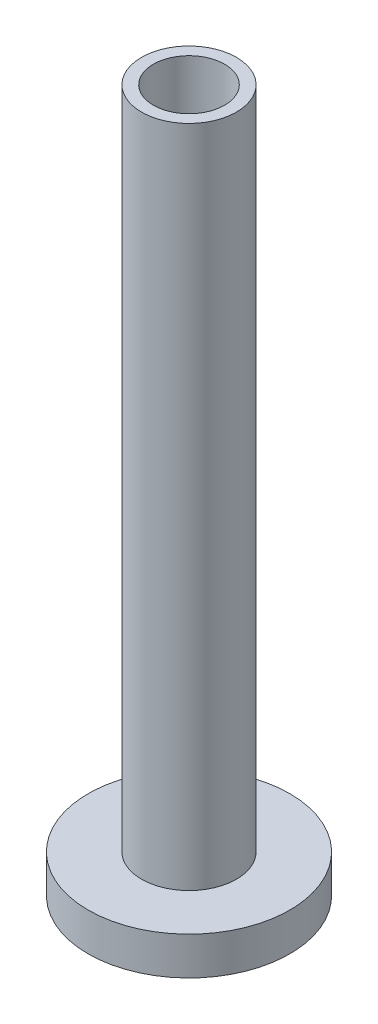
ISO-10303-21;
HEADER;
FILE_DESCRIPTION(('STEP AP214'),'2;1');
FILE_NAME('part.step','',(''),(''),'','','');
FILE_SCHEMA(('AUTOMOTIVE_DESIGN { 1 0 10303 214 1 1 1 1 }'));
ENDSEC;
DATA;
#1=APPLICATION_CONTEXT('core data for automotive mechanical design processes');
#2=APPLICATION_PROTOCOL_DEFINITION('international standard','automotive_design',2000,#1);
#3=PRODUCT_CONTEXT('',#1,'mechanical');
#4=PRODUCT('Part','Part','',(#3));
#5=PRODUCT_RELATED_PRODUCT_CATEGORY('part','',(#4));
#6=PRODUCT_DEFINITION_FORMATION('','',#4);
#7=PRODUCT_DEFINITION_CONTEXT('part definition',#1,'design');
#8=PRODUCT_DEFINITION('design','',#6,#7);
#9=PRODUCT_DEFINITION_SHAPE('','',#8);
#10=(LENGTH_UNIT() NAMED_UNIT(*) SI_UNIT(.MILLI.,.METRE.));
#11=(NAMED_UNIT(*) PLANE_ANGLE_UNIT() SI_UNIT($,.RADIAN.));
#12=(NAMED_UNIT(*) SI_UNIT($,.STERADIAN.) SOLID_ANGLE_UNIT());
#13=UNCERTAINTY_MEASURE_WITH_UNIT(LENGTH_MEASURE(1.E-05),#10,'distance_accuracy_value','');
#14=(GEOMETRIC_REPRESENTATION_CONTEXT(3) GLOBAL_UNCERTAINTY_ASSIGNED_CONTEXT((#13)) GLOBAL_UNIT_ASSIGNED_CONTEXT((#10,
#11,#12)) REPRESENTATION_CONTEXT('',''));
#15=CARTESIAN_POINT('',(0.,0.,0.));
#16=DIRECTION('',(0.,0.,1.));
#17=DIRECTION('',(1.,0.,0.));
#18=AXIS2_PLACEMENT_3D('',#15,#16,#17);
#19=CARTESIAN_POINT('',(0.,0.5,0.));
#20=DIRECTION('',(0.,-1.,0.));
#21=DIRECTION('',(0.,0.,-1.));
#22=AXIS2_PLACEMENT_3D('',#19,#20,#21);
#23=PLANE('',#22);
#24=DIRECTION('',(-0.5,0.,0.866025403784439));
#25=VECTOR('',#24,1.);
#26=CARTESIAN_POINT('',(-2.03647161368473,0.5,0.148273985177666));
#27=LINE('',#26,#25);
#28=CARTESIAN_POINT('',(-2.03647161368473,0.5,0.148273985177666));
#29=VERTEX_POINT('',#28);
#30=CARTESIAN_POINT('',(-1.3147837771977,0.5,-1.10172601482233));
#31=VERTEX_POINT('',#30);
#32=EDGE_CURVE('E90',#29,#31,#27,.F.);
#33=ORIENTED_EDGE('',*,*,#32,.T.);
#34=DIRECTION('',(-1.,0.,0.));
#35=VECTOR('',#34,1.);
#36=CARTESIAN_POINT('',(-1.3147837771977,0.5,-1.10172601482233));
#37=LINE('',#36,#35);
#38=CARTESIAN_POINT('',(0.128591895776368,0.5,-1.10172601482233));
#39=VERTEX_POINT('',#38);
#40=EDGE_CURVE('E132',#31,#39,#37,.F.);
#41=ORIENTED_EDGE('',*,*,#40,.T.);
#42=DIRECTION('',(-0.5,0.,-0.866025403784439));
#43=VECTOR('',#42,1.);
#44=CARTESIAN_POINT('',(0.128591895776368,0.5,-1.10172601482233));
#45=LINE('',#44,#43);
#46=CARTESIAN_POINT('',(0.8502797322634,0.5,0.148273985177666));
#47=VERTEX_POINT('',#46);
#48=EDGE_CURVE('E127',#39,#47,#45,.F.);
#49=ORIENTED_EDGE('',*,*,#48,.T.);
#50=DIRECTION('',(0.5,0.,-0.866025403784439));
#51=VECTOR('',#50,1.);
#52=CARTESIAN_POINT('',(0.8502797322634,0.5,0.148273985177666));
#53=LINE('',#52,#51);
#54=CARTESIAN_POINT('',(0.128591895776368,0.5,1.39827398517767));
#55=VERTEX_POINT('',#54);
#56=EDGE_CURVE('E73',#47,#55,#53,.F.);
#57=ORIENTED_EDGE('',*,*,#56,.T.);
#58=DIRECTION('',(1.,0.,0.));
#59=VECTOR('',#58,1.);
#60=CARTESIAN_POINT('',(0.128591895776368,0.5,1.39827398517767));
#61=LINE('',#60,#59);
#62=CARTESIAN_POINT('',(-1.3147837771977,0.5,1.39827398517767));
#63=VERTEX_POINT('',#62);
#64=EDGE_CURVE('E70',#55,#63,#61,.F.);
#65=ORIENTED_EDGE('',*,*,#64,.T.);
#66=DIRECTION('',(0.5,0.,0.866025403784439));
#67=VECTOR('',#66,1.);
#68=CARTESIAN_POINT('',(-1.3147837771977,0.5,1.39827398517767));
#69=LINE('',#68,#67);
#70=EDGE_CURVE('E67',#63,#29,#69,.F.);
#71=ORIENTED_EDGE('',*,*,#70,.T.);
#72=EDGE_LOOP('',(#33,#41,#49,#57,#65,#71));
#73=FACE_BOUND('',#72,.T.);
#74=ADVANCED_FACE('F16',(#73),#23,.T.);
#75=CARTESIAN_POINT('',(0.128591895776368,0.5,1.39827398517767));
#76=DIRECTION('',(0.,0.,1.));
#77=DIRECTION('',(1.,0.,0.));
#78=AXIS2_PLACEMENT_3D('',#75,#76,#77);
#79=PLANE('',#78);
#80=DIRECTION('',(0.,1.,0.));
#81=VECTOR('',#80,1.);
#82=CARTESIAN_POINT('',(-1.3147837771977,0.5,1.39827398517767));
#83=LINE('',#82,#81);
#84=CARTESIAN_POINT('',(-1.3147837771977,0.,1.39827398517767));
#85=VERTEX_POINT('',#84);
#86=EDGE_CURVE('E76',#85,#63,#83,.T.);
#87=ORIENTED_EDGE('',*,*,#86,.T.);
#88=ORIENTED_EDGE('',*,*,#64,.F.);
#89=DIRECTION('',(0.,1.,0.));
#90=VECTOR('',#89,1.);
#91=CARTESIAN_POINT('',(0.128591895776368,0.5,1.39827398517767));
#92=LINE('',#91,#90);
#93=CARTESIAN_POINT('',(0.128591895776368,0.,1.39827398517767));
#94=VERTEX_POINT('',#93);
#95=EDGE_CURVE('E122',#55,#94,#92,.F.);
#96=ORIENTED_EDGE('',*,*,#95,.T.);
#97=DIRECTION('',(1.,0.,0.));
#98=VECTOR('',#97,1.);
#99=CARTESIAN_POINT('',(-0.593095940710664,0.,1.39827398517767));
#100=LINE('',#99,#98);
#101=EDGE_CURVE('E81',#94,#85,#100,.F.);
#102=ORIENTED_EDGE('',*,*,#101,.T.);
#103=EDGE_LOOP('',(#87,#88,#96,#102));
#104=FACE_BOUND('',#103,.T.);
#105=ADVANCED_FACE('F79',(#104),#79,.F.);
#106=CARTESIAN_POINT('',(-1.3147837771977,0.5,1.39827398517767));
#107=DIRECTION('',(-0.866025403784439,0.,0.5));
#108=DIRECTION('',(0.5,0.,0.866025403784439));
#109=AXIS2_PLACEMENT_3D('',#106,#107,#108);
#110=PLANE('',#109);
#111=DIRECTION('',(0.,1.,0.));
#112=VECTOR('',#111,1.);
#113=CARTESIAN_POINT('',(-2.03647161368473,0.5,0.148273985177666));
#114=LINE('',#113,#112);
#115=CARTESIAN_POINT('',(-2.03647161368473,0.,0.148273985177666));
#116=VERTEX_POINT('',#115);
#117=EDGE_CURVE('E87',#116,#29,#114,.T.);
#118=ORIENTED_EDGE('',*,*,#117,.T.);
#119=ORIENTED_EDGE('',*,*,#70,.F.);
#120=ORIENTED_EDGE('',*,*,#86,.F.);
#121=DIRECTION('',(-0.5,0.,-0.866025403784439));
#122=VECTOR('',#121,1.);
#123=CARTESIAN_POINT('',(-1.3147837771977,0.,1.39827398517767));
#124=LINE('',#123,#122);
#125=EDGE_CURVE('E119',#85,#116,#124,.T.);
#126=ORIENTED_EDGE('',*,*,#125,.T.);
#127=EDGE_LOOP('',(#118,#119,#120,#126));
#128=FACE_BOUND('',#127,.T.);
#129=ADVANCED_FACE('F85',(#128),#110,.F.);
#130=CARTESIAN_POINT('',(-2.03647161368473,0.5,0.148273985177666));
#131=DIRECTION('',(-0.866025403784439,0.,-0.5));
#132=DIRECTION('',(-0.5,0.,0.866025403784439));
#133=AXIS2_PLACEMENT_3D('',#130,#131,#132);
#134=PLANE('',#133);
#135=DIRECTION('',(0.,1.,0.));
#136=VECTOR('',#135,1.);
#137=CARTESIAN_POINT('',(-1.3147837771977,0.5,-1.10172601482233));
#138=LINE('',#137,#136);
#139=CARTESIAN_POINT('',(-1.3147837771977,0.,-1.10172601482233));
#140=VERTEX_POINT('',#139);
#141=EDGE_CURVE('E134',#140,#31,#138,.T.);
#142=ORIENTED_EDGE('',*,*,#141,.T.);
#143=ORIENTED_EDGE('',*,*,#32,.F.);
#144=ORIENTED_EDGE('',*,*,#117,.F.);
#145=DIRECTION('',(0.5,0.,-0.866025403784439));
#146=VECTOR('',#145,1.);
#147=CARTESIAN_POINT('',(-2.03647161368473,0.,0.148273985177666));
#148=LINE('',#147,#146);
#149=EDGE_CURVE('E117',#116,#140,#148,.T.);
#150=ORIENTED_EDGE('',*,*,#149,.T.);
#151=EDGE_LOOP('',(#142,#143,#144,#150));
#152=FACE_BOUND('',#151,.T.);
#153=ADVANCED_FACE('F139',(#152),#134,.F.);
#154=CARTESIAN_POINT('',(-1.3147837771977,0.5,-1.10172601482233));
#155=DIRECTION('',(0.,0.,-1.));
#156=DIRECTION('',(-1.,0.,0.));
#157=AXIS2_PLACEMENT_3D('',#154,#155,#156);
#158=PLANE('',#157);
#159=DIRECTION('',(0.,1.,0.));
#160=VECTOR('',#159,1.);
#161=CARTESIAN_POINT('',(0.128591895776368,0.5,-1.10172601482233));
#162=LINE('',#161,#160);
#163=CARTESIAN_POINT('',(0.128591895776368,0.,-1.10172601482233));
#164=VERTEX_POINT('',#163);
#165=EDGE_CURVE('E129',#164,#39,#162,.T.);
#166=ORIENTED_EDGE('',*,*,#165,.T.);
#167=ORIENTED_EDGE('',*,*,#40,.F.);
#168=ORIENTED_EDGE('',*,*,#141,.F.);
#169=DIRECTION('',(1.,0.,0.));
#170=VECTOR('',#169,1.);
#171=CARTESIAN_POINT('',(-0.593095940710664,0.,-1.10172601482233));
#172=LINE('',#171,#170);
#173=EDGE_CURVE('E113',#140,#164,#172,.T.);
#174=ORIENTED_EDGE('',*,*,#173,.T.);
#175=EDGE_LOOP('',(#166,#167,#168,#174));
#176=FACE_BOUND('',#175,.T.);
#177=ADVANCED_FACE('F143',(#176),#158,.F.);
#178=CARTESIAN_POINT('',(0.128591895776368,0.5,-1.10172601482233));
#179=DIRECTION('',(0.866025403784439,0.,-0.5));
#180=DIRECTION('',(-0.5,0.,-0.866025403784439));
#181=AXIS2_PLACEMENT_3D('',#178,#179,#180);
#182=PLANE('',#181);
#183=DIRECTION('',(0.,1.,0.));
#184=VECTOR('',#183,1.);
#185=CARTESIAN_POINT('',(0.8502797322634,0.5,0.148273985177666));
#186=LINE('',#185,#184);
#187=CARTESIAN_POINT('',(0.8502797322634,0.,0.148273985177666));
#188=VERTEX_POINT('',#187);
#189=EDGE_CURVE('E125',#188,#47,#186,.T.);
#190=ORIENTED_EDGE('',*,*,#189,.T.);
#191=ORIENTED_EDGE('',*,*,#48,.F.);
#192=ORIENTED_EDGE('',*,*,#165,.F.);
#193=DIRECTION('',(0.5,0.,0.866025403784439));
#194=VECTOR('',#193,1.);
#195=CARTESIAN_POINT('',(0.128591895776368,0.,-1.10172601482233));
#196=LINE('',#195,#194);
#197=EDGE_CURVE('E34',#164,#188,#196,.T.);
#198=ORIENTED_EDGE('',*,*,#197,.T.);
#199=EDGE_LOOP('',(#190,#191,#192,#198));
#200=FACE_BOUND('',#199,.T.);
#201=ADVANCED_FACE('F145',(#200),#182,.F.);
#202=CARTESIAN_POINT('',(0.8502797322634,0.5,0.148273985177666));
#203=DIRECTION('',(0.866025403784439,0.,0.5));
#204=DIRECTION('',(0.5,0.,-0.866025403784439));
#205=AXIS2_PLACEMENT_3D('',#202,#203,#204);
#206=PLANE('',#205);
#207=ORIENTED_EDGE('',*,*,#95,.F.);
#208=ORIENTED_EDGE('',*,*,#56,.F.);
#209=ORIENTED_EDGE('',*,*,#189,.F.);
#210=DIRECTION('',(-0.5,0.,0.866025403784439));
#211=VECTOR('',#210,1.);
#212=CARTESIAN_POINT('',(0.8502797322634,0.,0.148273985177666));
#213=LINE('',#212,#211);
#214=EDGE_CURVE('E106',#188,#94,#213,.T.);
#215=ORIENTED_EDGE('',*,*,#214,.T.);
#216=EDGE_LOOP('',(#207,#208,#209,#215));
#217=FACE_BOUND('',#216,.T.);
#218=ADVANCED_FACE('F146',(#217),#206,.F.);
#219=CARTESIAN_POINT('',(-0.593095940710664,18.1,0.148273985177666));
#220=DIRECTION('',(0.,1.,0.));
#221=DIRECTION('',(0.,0.,1.));
#222=AXIS2_PLACEMENT_3D('',#219,#220,#221);
#223=PLANE('',#222);
#224=CARTESIAN_POINT('',(-0.593095940710664,18.1,0.148273985177666));
#225=DIRECTION('',(0.,1.,0.));
#226=DIRECTION('',(0.,0.,1.));
#227=AXIS2_PLACEMENT_3D('',#224,#225,#226);
#228=CIRCLE('',#227,1.5);
#229=CARTESIAN_POINT('',(-0.593095940710664,18.1,1.64827398517767));
#230=VERTEX_POINT('',#229);
#231=EDGE_CURVE('E19',#230,#230,#228,.T.);
#232=ORIENTED_EDGE('',*,*,#231,.T.);
#233=EDGE_LOOP('',(#232));
#234=FACE_BOUND('',#233,.T.);
#235=ADVANCED_FACE('F148',(#234),#223,.T.);
#236=CARTESIAN_POINT('',(-0.593095940710664,0.,0.148273985177666));
#237=DIRECTION('',(0.,1.,0.));
#238=DIRECTION('',(0.,0.,1.));
#239=AXIS2_PLACEMENT_3D('',#236,#237,#238);
#240=PLANE('',#239);
#241=CARTESIAN_POINT('',(-0.593095940710664,0.,0.148273985177666));
#242=DIRECTION('',(0.,-1.,0.));
#243=DIRECTION('',(0.,0.,-1.));
#244=AXIS2_PLACEMENT_3D('',#241,#242,#243);
#245=CIRCLE('',#244,4.25);
#246=CARTESIAN_POINT('',(-0.593095940710664,0.,-4.10172601482233));
#247=VERTEX_POINT('',#246);
#248=EDGE_CURVE('E101',#247,#247,#245,.F.);
#249=ORIENTED_EDGE('',*,*,#248,.F.);
#250=EDGE_LOOP('',(#249));
#251=FACE_BOUND('',#250,.T.);
#252=ORIENTED_EDGE('',*,*,#197,.F.);
#253=ORIENTED_EDGE('',*,*,#173,.F.);
#254=ORIENTED_EDGE('',*,*,#149,.F.);
#255=ORIENTED_EDGE('',*,*,#125,.F.);
#256=ORIENTED_EDGE('',*,*,#101,.F.);
#257=ORIENTED_EDGE('',*,*,#214,.F.);
#258=EDGE_LOOP('',(#252,#253,#254,#255,#256,#257));
#259=FACE_BOUND('',#258,.T.);
#260=ADVANCED_FACE('F155',(#251,#259),#240,.F.);
#261=CARTESIAN_POINT('',(-0.593095940710664,18.1,0.148273985177666));
#262=DIRECTION('',(0.,1.,0.));
#263=DIRECTION('',(0.,0.,1.));
#264=AXIS2_PLACEMENT_3D('',#261,#262,#263);
#265=CYLINDRICAL_SURFACE('',#264,1.5);
#266=CARTESIAN_POINT('',(-0.593095940710664,29.6,0.148273985177666));
#267=DIRECTION('',(0.,1.,0.));
#268=DIRECTION('',(0.,0.,1.));
#269=AXIS2_PLACEMENT_3D('',#266,#267,#268);
#270=CIRCLE('',#269,1.5);
#271=CARTESIAN_POINT('',(-0.593095940710664,29.6,1.64827398517767));
#272=VERTEX_POINT('',#271);
#273=EDGE_CURVE('E99',#272,#272,#270,.F.);
#274=ORIENTED_EDGE('',*,*,#273,.F.);
#275=EDGE_LOOP('',(#274));
#276=FACE_BOUND('',#275,.T.);
#277=ORIENTED_EDGE('',*,*,#231,.F.);
#278=EDGE_LOOP('',(#277));
#279=FACE_BOUND('',#278,.T.);
#280=ADVANCED_FACE('F177',(#276,#279),#265,.F.);
#281=CARTESIAN_POINT('',(-0.593095940710664,1.6,0.148273985177666));
#282=DIRECTION('',(0.,-1.,0.));
#283=DIRECTION('',(0.,0.,-1.));
#284=AXIS2_PLACEMENT_3D('',#281,#282,#283);
#285=CYLINDRICAL_SURFACE('',#284,4.25);
#286=ORIENTED_EDGE('',*,*,#248,.T.);
#287=EDGE_LOOP('',(#286));
#288=FACE_BOUND('',#287,.T.);
#289=CARTESIAN_POINT('',(-0.593095940710664,1.6,0.148273985177666));
#290=DIRECTION('',(0.,-1.,0.));
#291=DIRECTION('',(0.,0.,-1.));
#292=AXIS2_PLACEMENT_3D('',#289,#290,#291);
#293=CIRCLE('',#292,4.25);
#294=CARTESIAN_POINT('',(-0.593095940710664,1.6,-4.10172601482233));
#295=VERTEX_POINT('',#294);
#296=EDGE_CURVE('E96',#295,#295,#293,.F.);
#297=ORIENTED_EDGE('',*,*,#296,.F.);
#298=EDGE_LOOP('',(#297));
#299=FACE_BOUND('',#298,.T.);
#300=ADVANCED_FACE('F173',(#288,#299),#285,.T.);
#301=CARTESIAN_POINT('',(0.,29.6,0.));
#302=DIRECTION('',(0.,1.,0.));
#303=DIRECTION('',(0.,0.,1.));
#304=AXIS2_PLACEMENT_3D('',#301,#302,#303);
#305=PLANE('',#304);
#306=CARTESIAN_POINT('',(-0.593095940710664,29.6,0.148273985177666));
#307=DIRECTION('',(0.,-1.,0.));
#308=DIRECTION('',(0.,0.,-1.));
#309=AXIS2_PLACEMENT_3D('',#306,#307,#308);
#310=CIRCLE('',#309,2.);
#311=CARTESIAN_POINT('',(-0.593095940710664,29.6,-1.85172601482233));
#312=VERTEX_POINT('',#311);
#313=EDGE_CURVE('E25',#312,#312,#310,.T.);
#314=ORIENTED_EDGE('',*,*,#313,.F.);
#315=EDGE_LOOP('',(#314));
#316=FACE_BOUND('',#315,.T.);
#317=ORIENTED_EDGE('',*,*,#273,.T.);
#318=EDGE_LOOP('',(#317));
#319=FACE_BOUND('',#318,.T.);
#320=ADVANCED_FACE('F166',(#316,#319),#305,.T.);
#321=CARTESIAN_POINT('',(-0.593095940710664,1.6,0.148273985177666));
#322=DIRECTION('',(0.,1.,0.));
#323=DIRECTION('',(0.,0.,1.));
#324=AXIS2_PLACEMENT_3D('',#321,#322,#323);
#325=PLANE('',#324);
#326=CARTESIAN_POINT('',(-0.593095940710664,1.6,0.148273985177666));
#327=DIRECTION('',(0.,-1.,0.));
#328=DIRECTION('',(0.,0.,-1.));
#329=AXIS2_PLACEMENT_3D('',#326,#327,#328);
#330=CIRCLE('',#329,2.);
#331=CARTESIAN_POINT('',(-0.593095940710664,1.6,-1.85172601482233));
#332=VERTEX_POINT('',#331);
#333=EDGE_CURVE('E11',#332,#332,#330,.F.);
#334=ORIENTED_EDGE('',*,*,#333,.F.);
#335=EDGE_LOOP('',(#334));
#336=FACE_BOUND('',#335,.T.);
#337=ORIENTED_EDGE('',*,*,#296,.T.);
#338=EDGE_LOOP('',(#337));
#339=FACE_BOUND('',#338,.T.);
#340=ADVANCED_FACE('F160',(#336,#339),#325,.T.);
#341=CARTESIAN_POINT('',(-0.593095940710664,29.6,0.148273985177666));
#342=DIRECTION('',(0.,-1.,0.));
#343=DIRECTION('',(0.,0.,-1.));
#344=AXIS2_PLACEMENT_3D('',#341,#342,#343);
#345=CYLINDRICAL_SURFACE('',#344,2.);
#346=ORIENTED_EDGE('',*,*,#333,.T.);
#347=EDGE_LOOP('',(#346));
#348=FACE_BOUND('',#347,.T.);
#349=ORIENTED_EDGE('',*,*,#313,.T.);
#350=EDGE_LOOP('',(#349));
#351=FACE_BOUND('',#350,.T.);
#352=ADVANCED_FACE('F158',(#348,#351),#345,.T.);
#353=CLOSED_SHELL('',(#74,#105,#129,#153,#177,#201,#218,#235,#260,#280,#300,#320,#340,#352));
#354=MANIFOLD_SOLID_BREP('B1',#353);
#355=ADVANCED_BREP_SHAPE_REPRESENTATION('',(#18,#354),#14);
#356=SHAPE_DEFINITION_REPRESENTATION(#9,#355);
ENDSEC;
END-ISO-10303-21;
